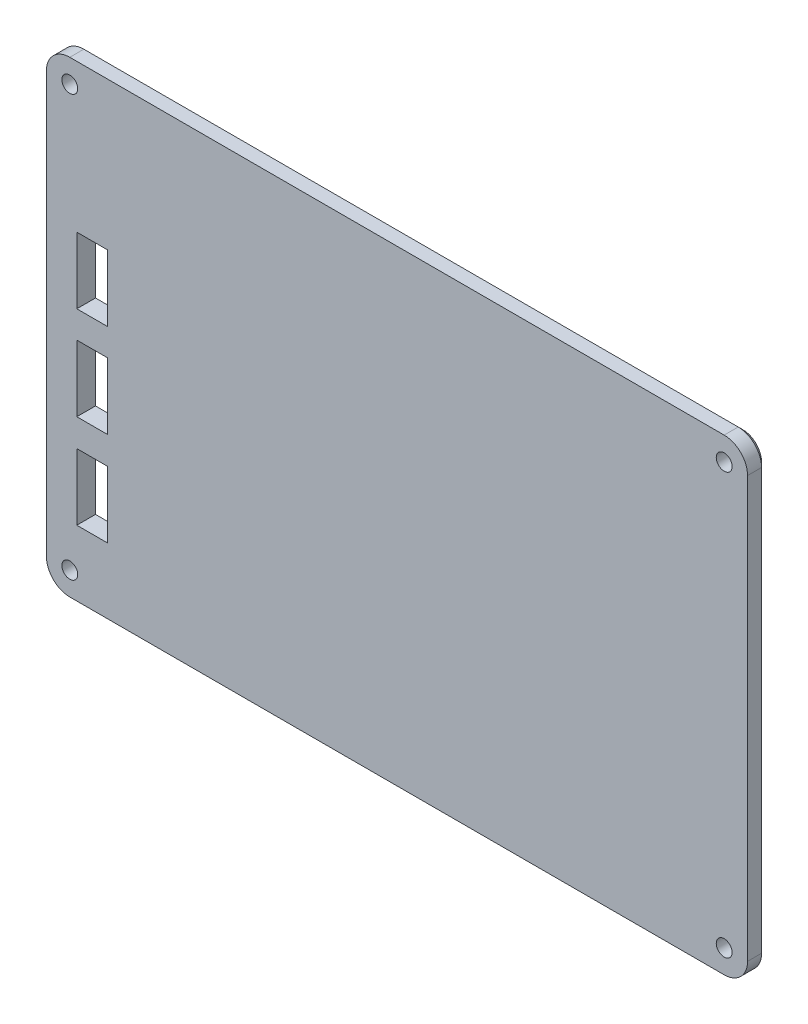
ISO-10303-21;
HEADER;
FILE_DESCRIPTION(('STEP AP214'),'2;1');
FILE_NAME('part.step','',(''),(''),'','','');
FILE_SCHEMA(('AUTOMOTIVE_DESIGN { 1 0 10303 214 1 1 1 1 }'));
ENDSEC;
DATA;
#1=APPLICATION_CONTEXT('core data for automotive mechanical design processes');
#2=APPLICATION_PROTOCOL_DEFINITION('international standard','automotive_design',2000,#1);
#3=PRODUCT_CONTEXT('',#1,'mechanical');
#4=PRODUCT('Part','Part','',(#3));
#5=PRODUCT_RELATED_PRODUCT_CATEGORY('part','',(#4));
#6=PRODUCT_DEFINITION_FORMATION('','',#4);
#7=PRODUCT_DEFINITION_CONTEXT('part definition',#1,'design');
#8=PRODUCT_DEFINITION('design','',#6,#7);
#9=PRODUCT_DEFINITION_SHAPE('','',#8);
#10=(LENGTH_UNIT() NAMED_UNIT(*) SI_UNIT(.MILLI.,.METRE.));
#11=(NAMED_UNIT(*) PLANE_ANGLE_UNIT() SI_UNIT($,.RADIAN.));
#12=(NAMED_UNIT(*) SI_UNIT($,.STERADIAN.) SOLID_ANGLE_UNIT());
#13=UNCERTAINTY_MEASURE_WITH_UNIT(LENGTH_MEASURE(1.E-05),#10,'distance_accuracy_value','');
#14=(GEOMETRIC_REPRESENTATION_CONTEXT(3) GLOBAL_UNCERTAINTY_ASSIGNED_CONTEXT((#13)) GLOBAL_UNIT_ASSIGNED_CONTEXT((#10,
#11,#12)) REPRESENTATION_CONTEXT('',''));
#15=CARTESIAN_POINT('',(0.,0.,0.));
#16=DIRECTION('',(0.,0.,1.));
#17=DIRECTION('',(1.,0.,0.));
#18=AXIS2_PLACEMENT_3D('',#15,#16,#17);
#19=CARTESIAN_POINT('',(70.,44.35,-90.));
#20=DIRECTION('',(0.,0.,1.));
#21=DIRECTION('',(1.,0.,0.));
#22=AXIS2_PLACEMENT_3D('',#19,#20,#21);
#23=CYLINDRICAL_SURFACE('',#22,5.);
#24=DIRECTION('',(0.,0.,1.));
#25=VECTOR('',#24,1.);
#26=CARTESIAN_POINT('',(75.,44.35,-90.));
#27=LINE('',#26,#25);
#28=CARTESIAN_POINT('',(75.,44.35,-89.));
#29=VERTEX_POINT('',#28);
#30=CARTESIAN_POINT('',(75.,44.35,-86.));
#31=VERTEX_POINT('',#30);
#32=EDGE_CURVE('E372',#29,#31,#27,.T.);
#33=ORIENTED_EDGE('',*,*,#32,.F.);
#34=CARTESIAN_POINT('',(70.,44.35,-89.));
#35=DIRECTION('',(0.,0.,-1.));
#36=DIRECTION('',(-1.,0.,0.));
#37=AXIS2_PLACEMENT_3D('',#34,#35,#36);
#38=CIRCLE('',#37,5.);
#39=CARTESIAN_POINT('',(70.,49.35,-89.));
#40=VERTEX_POINT('',#39);
#41=EDGE_CURVE('E44',#29,#40,#38,.F.);
#42=ORIENTED_EDGE('',*,*,#41,.T.);
#43=DIRECTION('',(0.,0.,1.));
#44=VECTOR('',#43,1.);
#45=CARTESIAN_POINT('',(70.,49.35,-90.));
#46=LINE('',#45,#44);
#47=CARTESIAN_POINT('',(70.,49.35,-86.));
#48=VERTEX_POINT('',#47);
#49=EDGE_CURVE('E358',#40,#48,#46,.T.);
#50=ORIENTED_EDGE('',*,*,#49,.T.);
#51=CARTESIAN_POINT('',(70.,44.35,-86.));
#52=DIRECTION('',(0.,0.,-1.));
#53=DIRECTION('',(-1.,0.,0.));
#54=AXIS2_PLACEMENT_3D('',#51,#52,#53);
#55=CIRCLE('',#54,5.);
#56=EDGE_CURVE('E334',#48,#31,#55,.T.);
#57=ORIENTED_EDGE('',*,*,#56,.T.);
#58=EDGE_LOOP('',(#33,#42,#50,#57));
#59=FACE_BOUND('',#58,.T.);
#60=ADVANCED_FACE('F35',(#59),#23,.T.);
#61=CARTESIAN_POINT('',(75.,44.35,-90.));
#62=DIRECTION('',(-1.,0.,0.));
#63=DIRECTION('',(0.,0.,1.));
#64=AXIS2_PLACEMENT_3D('',#61,#62,#63);
#65=PLANE('',#64);
#66=DIRECTION('',(0.,0.,1.));
#67=VECTOR('',#66,1.);
#68=CARTESIAN_POINT('',(75.,-45.65,-90.));
#69=LINE('',#68,#67);
#70=CARTESIAN_POINT('',(75.,-45.65,-89.));
#71=VERTEX_POINT('',#70);
#72=CARTESIAN_POINT('',(75.,-45.65,-86.));
#73=VERTEX_POINT('',#72);
#74=EDGE_CURVE('E370',#71,#73,#69,.T.);
#75=ORIENTED_EDGE('',*,*,#74,.F.);
#76=DIRECTION('',(0.,1.,0.));
#77=VECTOR('',#76,1.);
#78=CARTESIAN_POINT('',(75.,44.35,-89.));
#79=LINE('',#78,#77);
#80=EDGE_CURVE('E400',#71,#29,#79,.T.);
#81=ORIENTED_EDGE('',*,*,#80,.T.);
#82=ORIENTED_EDGE('',*,*,#32,.T.);
#83=DIRECTION('',(0.,-1.,0.));
#84=VECTOR('',#83,1.);
#85=CARTESIAN_POINT('',(75.,44.35,-86.));
#86=LINE('',#85,#84);
#87=EDGE_CURVE('E337',#31,#73,#86,.T.);
#88=ORIENTED_EDGE('',*,*,#87,.T.);
#89=EDGE_LOOP('',(#75,#81,#82,#88));
#90=FACE_BOUND('',#89,.T.);
#91=ADVANCED_FACE('F453',(#90),#65,.F.);
#92=CARTESIAN_POINT('',(70.,-45.65,-90.));
#93=DIRECTION('',(0.,0.,1.));
#94=DIRECTION('',(1.,0.,0.));
#95=AXIS2_PLACEMENT_3D('',#92,#93,#94);
#96=CYLINDRICAL_SURFACE('',#95,5.);
#97=DIRECTION('',(0.,0.,1.));
#98=VECTOR('',#97,1.);
#99=CARTESIAN_POINT('',(70.,-50.65,-90.));
#100=LINE('',#99,#98);
#101=CARTESIAN_POINT('',(70.,-50.65,-89.));
#102=VERTEX_POINT('',#101);
#103=CARTESIAN_POINT('',(70.,-50.65,-86.));
#104=VERTEX_POINT('',#103);
#105=EDGE_CURVE('E368',#102,#104,#100,.T.);
#106=ORIENTED_EDGE('',*,*,#105,.F.);
#107=CARTESIAN_POINT('',(70.,-45.65,-89.));
#108=DIRECTION('',(0.,0.,-1.));
#109=DIRECTION('',(-1.,0.,0.));
#110=AXIS2_PLACEMENT_3D('',#107,#108,#109);
#111=CIRCLE('',#110,5.);
#112=EDGE_CURVE('E396',#102,#71,#111,.F.);
#113=ORIENTED_EDGE('',*,*,#112,.T.);
#114=ORIENTED_EDGE('',*,*,#74,.T.);
#115=CARTESIAN_POINT('',(70.,-45.65,-86.));
#116=DIRECTION('',(0.,0.,-1.));
#117=DIRECTION('',(-1.,0.,0.));
#118=AXIS2_PLACEMENT_3D('',#115,#116,#117);
#119=CIRCLE('',#118,5.);
#120=EDGE_CURVE('E340',#73,#104,#119,.T.);
#121=ORIENTED_EDGE('',*,*,#120,.T.);
#122=EDGE_LOOP('',(#106,#113,#114,#121));
#123=FACE_BOUND('',#122,.T.);
#124=ADVANCED_FACE('F489',(#123),#96,.T.);
#125=CARTESIAN_POINT('',(70.,-50.65,-90.));
#126=DIRECTION('',(0.,1.,0.));
#127=DIRECTION('',(-1.,0.,0.));
#128=AXIS2_PLACEMENT_3D('',#125,#126,#127);
#129=PLANE('',#128);
#130=DIRECTION('',(0.,0.,1.));
#131=VECTOR('',#130,1.);
#132=CARTESIAN_POINT('',(-70.,-50.65,-90.));
#133=LINE('',#132,#131);
#134=CARTESIAN_POINT('',(-70.,-50.65,-89.));
#135=VERTEX_POINT('',#134);
#136=CARTESIAN_POINT('',(-70.,-50.65,-86.));
#137=VERTEX_POINT('',#136);
#138=EDGE_CURVE('E366',#135,#137,#133,.T.);
#139=ORIENTED_EDGE('',*,*,#138,.F.);
#140=DIRECTION('',(1.,0.,0.));
#141=VECTOR('',#140,1.);
#142=CARTESIAN_POINT('',(70.,-50.65,-89.));
#143=LINE('',#142,#141);
#144=EDGE_CURVE('E391',#135,#102,#143,.T.);
#145=ORIENTED_EDGE('',*,*,#144,.T.);
#146=ORIENTED_EDGE('',*,*,#105,.T.);
#147=DIRECTION('',(-1.,0.,0.));
#148=VECTOR('',#147,1.);
#149=CARTESIAN_POINT('',(70.,-50.65,-86.));
#150=LINE('',#149,#148);
#151=EDGE_CURVE('E343',#104,#137,#150,.T.);
#152=ORIENTED_EDGE('',*,*,#151,.T.);
#153=EDGE_LOOP('',(#139,#145,#146,#152));
#154=FACE_BOUND('',#153,.T.);
#155=ADVANCED_FACE('F485',(#154),#129,.F.);
#156=CARTESIAN_POINT('',(-70.,-45.65,-90.));
#157=DIRECTION('',(0.,0.,1.));
#158=DIRECTION('',(1.,0.,0.));
#159=AXIS2_PLACEMENT_3D('',#156,#157,#158);
#160=CYLINDRICAL_SURFACE('',#159,5.);
#161=DIRECTION('',(0.,0.,1.));
#162=VECTOR('',#161,1.);
#163=CARTESIAN_POINT('',(-75.,-45.65,-90.));
#164=LINE('',#163,#162);
#165=CARTESIAN_POINT('',(-75.,-45.65,-89.));
#166=VERTEX_POINT('',#165);
#167=CARTESIAN_POINT('',(-75.,-45.65,-86.));
#168=VERTEX_POINT('',#167);
#169=EDGE_CURVE('E364',#166,#168,#164,.T.);
#170=ORIENTED_EDGE('',*,*,#169,.F.);
#171=CARTESIAN_POINT('',(-70.,-45.65,-89.));
#172=DIRECTION('',(0.,0.,-1.));
#173=DIRECTION('',(-1.,0.,0.));
#174=AXIS2_PLACEMENT_3D('',#171,#172,#173);
#175=CIRCLE('',#174,5.);
#176=EDGE_CURVE('E394',#166,#135,#175,.F.);
#177=ORIENTED_EDGE('',*,*,#176,.T.);
#178=ORIENTED_EDGE('',*,*,#138,.T.);
#179=CARTESIAN_POINT('',(-70.,-45.65,-86.));
#180=DIRECTION('',(0.,0.,-1.));
#181=DIRECTION('',(-1.,0.,0.));
#182=AXIS2_PLACEMENT_3D('',#179,#180,#181);
#183=CIRCLE('',#182,5.);
#184=EDGE_CURVE('E346',#137,#168,#183,.T.);
#185=ORIENTED_EDGE('',*,*,#184,.T.);
#186=EDGE_LOOP('',(#170,#177,#178,#185));
#187=FACE_BOUND('',#186,.T.);
#188=ADVANCED_FACE('F480',(#187),#160,.T.);
#189=CARTESIAN_POINT('',(-75.,-45.65,-90.));
#190=DIRECTION('',(1.,0.,0.));
#191=DIRECTION('',(0.,0.,-1.));
#192=AXIS2_PLACEMENT_3D('',#189,#190,#191);
#193=PLANE('',#192);
#194=DIRECTION('',(0.,0.,1.));
#195=VECTOR('',#194,1.);
#196=CARTESIAN_POINT('',(-75.,44.35,-90.));
#197=LINE('',#196,#195);
#198=CARTESIAN_POINT('',(-75.,44.35,-89.));
#199=VERTEX_POINT('',#198);
#200=CARTESIAN_POINT('',(-75.,44.35,-86.));
#201=VERTEX_POINT('',#200);
#202=EDGE_CURVE('E362',#199,#201,#197,.T.);
#203=ORIENTED_EDGE('',*,*,#202,.F.);
#204=DIRECTION('',(0.,-1.,0.));
#205=VECTOR('',#204,1.);
#206=CARTESIAN_POINT('',(-75.,-45.65,-89.));
#207=LINE('',#206,#205);
#208=EDGE_CURVE('E398',#199,#166,#207,.T.);
#209=ORIENTED_EDGE('',*,*,#208,.T.);
#210=ORIENTED_EDGE('',*,*,#169,.T.);
#211=DIRECTION('',(0.,1.,0.));
#212=VECTOR('',#211,1.);
#213=CARTESIAN_POINT('',(-75.,-45.65,-86.));
#214=LINE('',#213,#212);
#215=EDGE_CURVE('E349',#168,#201,#214,.T.);
#216=ORIENTED_EDGE('',*,*,#215,.T.);
#217=EDGE_LOOP('',(#203,#209,#210,#216));
#218=FACE_BOUND('',#217,.T.);
#219=ADVANCED_FACE('F478',(#218),#193,.F.);
#220=CARTESIAN_POINT('',(-70.,44.35,-90.));
#221=DIRECTION('',(0.,0.,1.));
#222=DIRECTION('',(1.,0.,0.));
#223=AXIS2_PLACEMENT_3D('',#220,#221,#222);
#224=CYLINDRICAL_SURFACE('',#223,5.);
#225=DIRECTION('',(0.,0.,1.));
#226=VECTOR('',#225,1.);
#227=CARTESIAN_POINT('',(-70.,49.35,-90.));
#228=LINE('',#227,#226);
#229=CARTESIAN_POINT('',(-70.,49.35,-89.));
#230=VERTEX_POINT('',#229);
#231=CARTESIAN_POINT('',(-70.,49.35,-86.));
#232=VERTEX_POINT('',#231);
#233=EDGE_CURVE('E360',#230,#232,#228,.T.);
#234=ORIENTED_EDGE('',*,*,#233,.F.);
#235=CARTESIAN_POINT('',(-70.,44.35,-89.));
#236=DIRECTION('',(0.,0.,-1.));
#237=DIRECTION('',(-1.,0.,0.));
#238=AXIS2_PLACEMENT_3D('',#235,#236,#237);
#239=CIRCLE('',#238,5.);
#240=EDGE_CURVE('E402',#230,#199,#239,.F.);
#241=ORIENTED_EDGE('',*,*,#240,.T.);
#242=ORIENTED_EDGE('',*,*,#202,.T.);
#243=CARTESIAN_POINT('',(-70.,44.35,-86.));
#244=DIRECTION('',(0.,0.,-1.));
#245=DIRECTION('',(-1.,0.,0.));
#246=AXIS2_PLACEMENT_3D('',#243,#244,#245);
#247=CIRCLE('',#246,5.);
#248=EDGE_CURVE('E352',#201,#232,#247,.T.);
#249=ORIENTED_EDGE('',*,*,#248,.T.);
#250=EDGE_LOOP('',(#234,#241,#242,#249));
#251=FACE_BOUND('',#250,.T.);
#252=ADVANCED_FACE('F440',(#251),#224,.T.);
#253=CARTESIAN_POINT('',(-70.,49.35,-90.));
#254=DIRECTION('',(0.,-1.,0.));
#255=DIRECTION('',(1.,0.,0.));
#256=AXIS2_PLACEMENT_3D('',#253,#254,#255);
#257=PLANE('',#256);
#258=ORIENTED_EDGE('',*,*,#49,.F.);
#259=DIRECTION('',(-1.,0.,0.));
#260=VECTOR('',#259,1.);
#261=CARTESIAN_POINT('',(-70.,49.35,-89.));
#262=LINE('',#261,#260);
#263=EDGE_CURVE('E11',#40,#230,#262,.T.);
#264=ORIENTED_EDGE('',*,*,#263,.T.);
#265=ORIENTED_EDGE('',*,*,#233,.T.);
#266=DIRECTION('',(1.,0.,0.));
#267=VECTOR('',#266,1.);
#268=CARTESIAN_POINT('',(-70.,49.35,-86.));
#269=LINE('',#268,#267);
#270=EDGE_CURVE('E355',#232,#48,#269,.T.);
#271=ORIENTED_EDGE('',*,*,#270,.T.);
#272=EDGE_LOOP('',(#258,#264,#265,#271));
#273=FACE_BOUND('',#272,.T.);
#274=ADVANCED_FACE('F438',(#273),#257,.F.);
#275=CARTESIAN_POINT('',(70.,44.35,-90.));
#276=DIRECTION('',(0.,0.,-1.));
#277=DIRECTION('',(-1.,0.,0.));
#278=AXIS2_PLACEMENT_3D('',#275,#276,#277);
#279=PLANE('',#278);
#280=DIRECTION('',(0.,-1.,0.));
#281=VECTOR('',#280,1.);
#282=CARTESIAN_POINT('',(-61.9,17.7,-90.));
#283=LINE('',#282,#281);
#284=CARTESIAN_POINT('',(-61.9,17.7,-90.));
#285=VERTEX_POINT('',#284);
#286=CARTESIAN_POINT('',(-61.9,3.5,-90.));
#287=VERTEX_POINT('',#286);
#288=EDGE_CURVE('E52',#285,#287,#283,.T.);
#289=ORIENTED_EDGE('',*,*,#288,.F.);
#290=DIRECTION('',(1.,0.,0.));
#291=VECTOR('',#290,1.);
#292=CARTESIAN_POINT('',(-68.5,17.7,-90.));
#293=LINE('',#292,#291);
#294=CARTESIAN_POINT('',(-68.5,17.7,-90.));
#295=VERTEX_POINT('',#294);
#296=EDGE_CURVE('E215',#295,#285,#293,.T.);
#297=ORIENTED_EDGE('',*,*,#296,.F.);
#298=DIRECTION('',(0.,1.,0.));
#299=VECTOR('',#298,1.);
#300=CARTESIAN_POINT('',(-68.5,3.5,-90.));
#301=LINE('',#300,#299);
#302=CARTESIAN_POINT('',(-68.5,3.5,-90.));
#303=VERTEX_POINT('',#302);
#304=EDGE_CURVE('E218',#303,#295,#301,.T.);
#305=ORIENTED_EDGE('',*,*,#304,.F.);
#306=DIRECTION('',(-1.,0.,0.));
#307=VECTOR('',#306,1.);
#308=CARTESIAN_POINT('',(-61.9,3.5,-90.));
#309=LINE('',#308,#307);
#310=EDGE_CURVE('E224',#287,#303,#309,.T.);
#311=ORIENTED_EDGE('',*,*,#310,.F.);
#312=EDGE_LOOP('',(#289,#297,#305,#311));
#313=FACE_BOUND('',#312,.T.);
#314=DIRECTION('',(0.,-1.,0.));
#315=VECTOR('',#314,1.);
#316=CARTESIAN_POINT('',(-61.9,-2.3,-90.));
#317=LINE('',#316,#315);
#318=CARTESIAN_POINT('',(-61.9,-2.3,-90.));
#319=VERTEX_POINT('',#318);
#320=CARTESIAN_POINT('',(-61.9,-16.5,-90.));
#321=VERTEX_POINT('',#320);
#322=EDGE_CURVE('E230',#319,#321,#317,.T.);
#323=ORIENTED_EDGE('',*,*,#322,.F.);
#324=DIRECTION('',(1.,0.,0.));
#325=VECTOR('',#324,1.);
#326=CARTESIAN_POINT('',(-68.5,-2.3,-90.));
#327=LINE('',#326,#325);
#328=CARTESIAN_POINT('',(-68.5,-2.3,-90.));
#329=VERTEX_POINT('',#328);
#330=EDGE_CURVE('E238',#329,#319,#327,.T.);
#331=ORIENTED_EDGE('',*,*,#330,.F.);
#332=DIRECTION('',(0.,1.,0.));
#333=VECTOR('',#332,1.);
#334=CARTESIAN_POINT('',(-68.5,-16.5,-90.));
#335=LINE('',#334,#333);
#336=CARTESIAN_POINT('',(-68.5,-16.5,-90.));
#337=VERTEX_POINT('',#336);
#338=EDGE_CURVE('E252',#337,#329,#335,.T.);
#339=ORIENTED_EDGE('',*,*,#338,.F.);
#340=DIRECTION('',(-1.,0.,0.));
#341=VECTOR('',#340,1.);
#342=CARTESIAN_POINT('',(-61.9,-16.5,-90.));
#343=LINE('',#342,#341);
#344=EDGE_CURVE('E249',#321,#337,#343,.T.);
#345=ORIENTED_EDGE('',*,*,#344,.F.);
#346=EDGE_LOOP('',(#323,#331,#339,#345));
#347=FACE_BOUND('',#346,.T.);
#348=DIRECTION('',(1.,0.,0.));
#349=VECTOR('',#348,1.);
#350=CARTESIAN_POINT('',(-68.5,-22.4,-90.));
#351=LINE('',#350,#349);
#352=CARTESIAN_POINT('',(-68.5,-22.4,-90.));
#353=VERTEX_POINT('',#352);
#354=CARTESIAN_POINT('',(-61.9,-22.4,-90.));
#355=VERTEX_POINT('',#354);
#356=EDGE_CURVE('E259',#353,#355,#351,.T.);
#357=ORIENTED_EDGE('',*,*,#356,.F.);
#358=DIRECTION('',(0.,1.,0.));
#359=VECTOR('',#358,1.);
#360=CARTESIAN_POINT('',(-68.5,-36.6,-90.));
#361=LINE('',#360,#359);
#362=CARTESIAN_POINT('',(-68.5,-36.6,-90.));
#363=VERTEX_POINT('',#362);
#364=EDGE_CURVE('E270',#363,#353,#361,.T.);
#365=ORIENTED_EDGE('',*,*,#364,.F.);
#366=DIRECTION('',(-1.,0.,0.));
#367=VECTOR('',#366,1.);
#368=CARTESIAN_POINT('',(-61.9,-36.6,-90.));
#369=LINE('',#368,#367);
#370=CARTESIAN_POINT('',(-61.9,-36.6,-90.));
#371=VERTEX_POINT('',#370);
#372=EDGE_CURVE('E284',#371,#363,#369,.T.);
#373=ORIENTED_EDGE('',*,*,#372,.F.);
#374=DIRECTION('',(0.,-1.,0.));
#375=VECTOR('',#374,1.);
#376=CARTESIAN_POINT('',(-61.9,-22.4,-90.));
#377=LINE('',#376,#375);
#378=EDGE_CURVE('E281',#355,#371,#377,.T.);
#379=ORIENTED_EDGE('',*,*,#378,.F.);
#380=EDGE_LOOP('',(#357,#365,#373,#379));
#381=FACE_BOUND('',#380,.T.);
#382=CARTESIAN_POINT('',(70.,-45.65,-90.));
#383=DIRECTION('',(0.,0.,-1.));
#384=DIRECTION('',(-1.,0.,0.));
#385=AXIS2_PLACEMENT_3D('',#382,#383,#384);
#386=CIRCLE('',#385,4.00000000000003);
#387=CARTESIAN_POINT('',(74.,-45.65,-90.));
#388=VERTEX_POINT('',#387);
#389=CARTESIAN_POINT('',(70.,-49.65,-90.));
#390=VERTEX_POINT('',#389);
#391=EDGE_CURVE('E384',#388,#390,#386,.T.);
#392=ORIENTED_EDGE('',*,*,#391,.T.);
#393=DIRECTION('',(-1.,0.,0.));
#394=VECTOR('',#393,1.);
#395=CARTESIAN_POINT('',(-70.,-49.65,-90.));
#396=LINE('',#395,#394);
#397=CARTESIAN_POINT('',(-70.,-49.65,-90.));
#398=VERTEX_POINT('',#397);
#399=EDGE_CURVE('E388',#390,#398,#396,.T.);
#400=ORIENTED_EDGE('',*,*,#399,.T.);
#401=CARTESIAN_POINT('',(-70.,-45.65,-90.));
#402=DIRECTION('',(0.,0.,-1.));
#403=DIRECTION('',(-1.,0.,0.));
#404=AXIS2_PLACEMENT_3D('',#401,#402,#403);
#405=CIRCLE('',#404,4.00000000000003);
#406=CARTESIAN_POINT('',(-74.,-45.65,-90.));
#407=VERTEX_POINT('',#406);
#408=EDGE_CURVE('E386',#398,#407,#405,.T.);
#409=ORIENTED_EDGE('',*,*,#408,.T.);
#410=DIRECTION('',(0.,1.,0.));
#411=VECTOR('',#410,1.);
#412=CARTESIAN_POINT('',(-74.,44.35,-90.));
#413=LINE('',#412,#411);
#414=CARTESIAN_POINT('',(-74.,44.35,-90.));
#415=VERTEX_POINT('',#414);
#416=EDGE_CURVE('E382',#407,#415,#413,.T.);
#417=ORIENTED_EDGE('',*,*,#416,.T.);
#418=CARTESIAN_POINT('',(-70.,44.35,-90.));
#419=DIRECTION('',(0.,0.,-1.));
#420=DIRECTION('',(-1.,0.,0.));
#421=AXIS2_PLACEMENT_3D('',#418,#419,#420);
#422=CIRCLE('',#421,4.00000000000003);
#423=CARTESIAN_POINT('',(-70.,48.35,-90.));
#424=VERTEX_POINT('',#423);
#425=EDGE_CURVE('E378',#415,#424,#422,.T.);
#426=ORIENTED_EDGE('',*,*,#425,.T.);
#427=DIRECTION('',(1.,0.,0.));
#428=VECTOR('',#427,1.);
#429=CARTESIAN_POINT('',(70.,48.35,-90.));
#430=LINE('',#429,#428);
#431=CARTESIAN_POINT('',(70.,48.35,-90.));
#432=VERTEX_POINT('',#431);
#433=EDGE_CURVE('E374',#424,#432,#430,.T.);
#434=ORIENTED_EDGE('',*,*,#433,.T.);
#435=CARTESIAN_POINT('',(70.,44.35,-90.));
#436=DIRECTION('',(0.,0.,-1.));
#437=DIRECTION('',(-1.,0.,0.));
#438=AXIS2_PLACEMENT_3D('',#435,#436,#437);
#439=CIRCLE('',#438,4.00000000000003);
#440=CARTESIAN_POINT('',(74.,44.35,-90.));
#441=VERTEX_POINT('',#440);
#442=EDGE_CURVE('E376',#432,#441,#439,.T.);
#443=ORIENTED_EDGE('',*,*,#442,.T.);
#444=DIRECTION('',(0.,-1.,0.));
#445=VECTOR('',#444,1.);
#446=CARTESIAN_POINT('',(74.,-45.65,-90.));
#447=LINE('',#446,#445);
#448=EDGE_CURVE('E380',#441,#388,#447,.T.);
#449=ORIENTED_EDGE('',*,*,#448,.T.);
#450=EDGE_LOOP('',(#392,#400,#409,#417,#426,#434,#443,#449));
#451=FACE_BOUND('',#450,.T.);
#452=CARTESIAN_POINT('',(-70.,-45.6578119509744,-90.));
#453=DIRECTION('',(0.,0.,-1.));
#454=DIRECTION('',(-1.,0.,0.));
#455=AXIS2_PLACEMENT_3D('',#452,#453,#454);
#456=CIRCLE('',#455,3.15);
#457=CARTESIAN_POINT('',(-73.15,-45.6578119509744,-90.));
#458=VERTEX_POINT('',#457);
#459=EDGE_CURVE('E298',#458,#458,#456,.T.);
#460=ORIENTED_EDGE('',*,*,#459,.F.);
#461=EDGE_LOOP('',(#460));
#462=FACE_BOUND('',#461,.T.);
#463=CARTESIAN_POINT('',(-70.,44.3578119509744,-90.));
#464=DIRECTION('',(0.,0.,-1.));
#465=DIRECTION('',(-1.,0.,0.));
#466=AXIS2_PLACEMENT_3D('',#463,#464,#465);
#467=CIRCLE('',#466,3.15);
#468=CARTESIAN_POINT('',(-73.15,44.3578119509744,-90.));
#469=VERTEX_POINT('',#468);
#470=EDGE_CURVE('E307',#469,#469,#467,.T.);
#471=ORIENTED_EDGE('',*,*,#470,.F.);
#472=EDGE_LOOP('',(#471));
#473=FACE_BOUND('',#472,.T.);
#474=CARTESIAN_POINT('',(70.,44.3578119509744,-90.));
#475=DIRECTION('',(0.,0.,-1.));
#476=DIRECTION('',(-1.,0.,0.));
#477=AXIS2_PLACEMENT_3D('',#474,#475,#476);
#478=CIRCLE('',#477,3.15);
#479=CARTESIAN_POINT('',(66.85,44.3578119509744,-90.));
#480=VERTEX_POINT('',#479);
#481=EDGE_CURVE('E316',#480,#480,#478,.T.);
#482=ORIENTED_EDGE('',*,*,#481,.F.);
#483=EDGE_LOOP('',(#482));
#484=FACE_BOUND('',#483,.T.);
#485=CARTESIAN_POINT('',(70.,-45.6578119509744,-90.));
#486=DIRECTION('',(0.,0.,-1.));
#487=DIRECTION('',(-1.,0.,0.));
#488=AXIS2_PLACEMENT_3D('',#485,#486,#487);
#489=CIRCLE('',#488,3.15);
#490=CARTESIAN_POINT('',(66.85,-45.6578119509744,-90.));
#491=VERTEX_POINT('',#490);
#492=EDGE_CURVE('E325',#491,#491,#489,.T.);
#493=ORIENTED_EDGE('',*,*,#492,.F.);
#494=EDGE_LOOP('',(#493));
#495=FACE_BOUND('',#494,.T.);
#496=ADVANCED_FACE('F466',(#313,#347,#381,#451,#462,#473,#484,#495),#279,.T.);
#497=CARTESIAN_POINT('',(70.,44.35,-86.));
#498=DIRECTION('',(0.,0.,-1.));
#499=DIRECTION('',(-1.,0.,0.));
#500=AXIS2_PLACEMENT_3D('',#497,#498,#499);
#501=PLANE('',#500);
#502=DIRECTION('',(1.,0.,0.));
#503=VECTOR('',#502,1.);
#504=CARTESIAN_POINT('',(-68.5,17.7,-86.));
#505=LINE('',#504,#503);
#506=CARTESIAN_POINT('',(-68.5,17.7,-86.));
#507=VERTEX_POINT('',#506);
#508=CARTESIAN_POINT('',(-61.9,17.7,-86.));
#509=VERTEX_POINT('',#508);
#510=EDGE_CURVE('E205',#507,#509,#505,.T.);
#511=ORIENTED_EDGE('',*,*,#510,.T.);
#512=DIRECTION('',(0.,-1.,0.));
#513=VECTOR('',#512,1.);
#514=CARTESIAN_POINT('',(-61.9,17.7,-86.));
#515=LINE('',#514,#513);
#516=CARTESIAN_POINT('',(-61.9,3.5,-86.));
#517=VERTEX_POINT('',#516);
#518=EDGE_CURVE('E199',#509,#517,#515,.T.);
#519=ORIENTED_EDGE('',*,*,#518,.T.);
#520=DIRECTION('',(-1.,0.,0.));
#521=VECTOR('',#520,1.);
#522=CARTESIAN_POINT('',(-61.9,3.5,-86.));
#523=LINE('',#522,#521);
#524=CARTESIAN_POINT('',(-68.5,3.5,-86.));
#525=VERTEX_POINT('',#524);
#526=EDGE_CURVE('E208',#517,#525,#523,.T.);
#527=ORIENTED_EDGE('',*,*,#526,.T.);
#528=DIRECTION('',(0.,1.,0.));
#529=VECTOR('',#528,1.);
#530=CARTESIAN_POINT('',(-68.5,3.5,-86.));
#531=LINE('',#530,#529);
#532=EDGE_CURVE('E60',#525,#507,#531,.T.);
#533=ORIENTED_EDGE('',*,*,#532,.T.);
#534=EDGE_LOOP('',(#511,#519,#527,#533));
#535=FACE_BOUND('',#534,.T.);
#536=DIRECTION('',(1.,0.,0.));
#537=VECTOR('',#536,1.);
#538=CARTESIAN_POINT('',(-68.5,-2.3,-86.));
#539=LINE('',#538,#537);
#540=CARTESIAN_POINT('',(-68.5,-2.3,-86.));
#541=VERTEX_POINT('',#540);
#542=CARTESIAN_POINT('',(-61.9,-2.3,-86.));
#543=VERTEX_POINT('',#542);
#544=EDGE_CURVE('E244',#541,#543,#539,.T.);
#545=ORIENTED_EDGE('',*,*,#544,.T.);
#546=DIRECTION('',(0.,-1.,0.));
#547=VECTOR('',#546,1.);
#548=CARTESIAN_POINT('',(-61.9,-2.3,-86.));
#549=LINE('',#548,#547);
#550=CARTESIAN_POINT('',(-61.9,-16.5,-86.));
#551=VERTEX_POINT('',#550);
#552=EDGE_CURVE('E234',#543,#551,#549,.T.);
#553=ORIENTED_EDGE('',*,*,#552,.T.);
#554=DIRECTION('',(-1.,0.,0.));
#555=VECTOR('',#554,1.);
#556=CARTESIAN_POINT('',(-61.9,-16.5,-86.));
#557=LINE('',#556,#555);
#558=CARTESIAN_POINT('',(-68.5,-16.5,-86.));
#559=VERTEX_POINT('',#558);
#560=EDGE_CURVE('E237',#551,#559,#557,.T.);
#561=ORIENTED_EDGE('',*,*,#560,.T.);
#562=DIRECTION('',(0.,1.,0.));
#563=VECTOR('',#562,1.);
#564=CARTESIAN_POINT('',(-68.5,-16.5,-86.));
#565=LINE('',#564,#563);
#566=EDGE_CURVE('E241',#559,#541,#565,.T.);
#567=ORIENTED_EDGE('',*,*,#566,.T.);
#568=EDGE_LOOP('',(#545,#553,#561,#567));
#569=FACE_BOUND('',#568,.T.);
#570=DIRECTION('',(0.,1.,0.));
#571=VECTOR('',#570,1.);
#572=CARTESIAN_POINT('',(-68.5,-36.6,-86.));
#573=LINE('',#572,#571);
#574=CARTESIAN_POINT('',(-68.5,-36.6,-86.));
#575=VERTEX_POINT('',#574);
#576=CARTESIAN_POINT('',(-68.5,-22.4,-86.));
#577=VERTEX_POINT('',#576);
#578=EDGE_CURVE('E276',#575,#577,#573,.T.);
#579=ORIENTED_EDGE('',*,*,#578,.T.);
#580=DIRECTION('',(1.,0.,0.));
#581=VECTOR('',#580,1.);
#582=CARTESIAN_POINT('',(-68.5,-22.4,-86.));
#583=LINE('',#582,#581);
#584=CARTESIAN_POINT('',(-61.9,-22.4,-86.));
#585=VERTEX_POINT('',#584);
#586=EDGE_CURVE('E266',#577,#585,#583,.T.);
#587=ORIENTED_EDGE('',*,*,#586,.T.);
#588=DIRECTION('',(0.,-1.,0.));
#589=VECTOR('',#588,1.);
#590=CARTESIAN_POINT('',(-61.9,-22.4,-86.));
#591=LINE('',#590,#589);
#592=CARTESIAN_POINT('',(-61.9,-36.6,-86.));
#593=VERTEX_POINT('',#592);
#594=EDGE_CURVE('E269',#585,#593,#591,.T.);
#595=ORIENTED_EDGE('',*,*,#594,.T.);
#596=DIRECTION('',(-1.,0.,0.));
#597=VECTOR('',#596,1.);
#598=CARTESIAN_POINT('',(-61.9,-36.6,-86.));
#599=LINE('',#598,#597);
#600=EDGE_CURVE('E273',#593,#575,#599,.T.);
#601=ORIENTED_EDGE('',*,*,#600,.T.);
#602=EDGE_LOOP('',(#579,#587,#595,#601));
#603=FACE_BOUND('',#602,.T.);
#604=CARTESIAN_POINT('',(-70.,-45.6578119509744,-86.));
#605=DIRECTION('',(0.,0.,-1.));
#606=DIRECTION('',(-1.,0.,0.));
#607=AXIS2_PLACEMENT_3D('',#604,#605,#606);
#608=CIRCLE('',#607,1.69999999999999);
#609=CARTESIAN_POINT('',(-71.7,-45.6578119509744,-86.));
#610=VERTEX_POINT('',#609);
#611=EDGE_CURVE('E304',#610,#610,#608,.T.);
#612=ORIENTED_EDGE('',*,*,#611,.T.);
#613=EDGE_LOOP('',(#612));
#614=FACE_BOUND('',#613,.T.);
#615=CARTESIAN_POINT('',(-70.,44.3578119509744,-86.));
#616=DIRECTION('',(0.,0.,-1.));
#617=DIRECTION('',(-1.,0.,0.));
#618=AXIS2_PLACEMENT_3D('',#615,#616,#617);
#619=CIRCLE('',#618,1.69999999999999);
#620=CARTESIAN_POINT('',(-71.7,44.3578119509744,-86.));
#621=VERTEX_POINT('',#620);
#622=EDGE_CURVE('E313',#621,#621,#619,.T.);
#623=ORIENTED_EDGE('',*,*,#622,.T.);
#624=EDGE_LOOP('',(#623));
#625=FACE_BOUND('',#624,.T.);
#626=CARTESIAN_POINT('',(70.,44.3578119509744,-86.));
#627=DIRECTION('',(0.,0.,-1.));
#628=DIRECTION('',(-1.,0.,0.));
#629=AXIS2_PLACEMENT_3D('',#626,#627,#628);
#630=CIRCLE('',#629,1.69999999999999);
#631=CARTESIAN_POINT('',(68.3,44.3578119509744,-86.));
#632=VERTEX_POINT('',#631);
#633=EDGE_CURVE('E322',#632,#632,#630,.T.);
#634=ORIENTED_EDGE('',*,*,#633,.T.);
#635=EDGE_LOOP('',(#634));
#636=FACE_BOUND('',#635,.T.);
#637=CARTESIAN_POINT('',(70.,-45.6578119509744,-86.));
#638=DIRECTION('',(0.,0.,-1.));
#639=DIRECTION('',(-1.,0.,0.));
#640=AXIS2_PLACEMENT_3D('',#637,#638,#639);
#641=CIRCLE('',#640,1.69999999999999);
#642=CARTESIAN_POINT('',(68.3,-45.6578119509744,-86.));
#643=VERTEX_POINT('',#642);
#644=EDGE_CURVE('E331',#643,#643,#641,.T.);
#645=ORIENTED_EDGE('',*,*,#644,.T.);
#646=EDGE_LOOP('',(#645));
#647=FACE_BOUND('',#646,.T.);
#648=ORIENTED_EDGE('',*,*,#56,.F.);
#649=ORIENTED_EDGE('',*,*,#270,.F.);
#650=ORIENTED_EDGE('',*,*,#248,.F.);
#651=ORIENTED_EDGE('',*,*,#215,.F.);
#652=ORIENTED_EDGE('',*,*,#184,.F.);
#653=ORIENTED_EDGE('',*,*,#151,.F.);
#654=ORIENTED_EDGE('',*,*,#120,.F.);
#655=ORIENTED_EDGE('',*,*,#87,.F.);
#656=EDGE_LOOP('',(#648,#649,#650,#651,#652,#653,#654,#655));
#657=FACE_BOUND('',#656,.T.);
#658=ADVANCED_FACE('F212',(#535,#569,#603,#614,#625,#636,#647,#657),#501,.F.);
#659=CARTESIAN_POINT('',(70.,-45.6578119509744,-90.));
#660=DIRECTION('',(0.,0.,-1.));
#661=DIRECTION('',(-1.,0.,0.));
#662=AXIS2_PLACEMENT_3D('',#659,#660,#661);
#663=CYLINDRICAL_SURFACE('',#662,1.69999999999999);
#664=ORIENTED_EDGE('',*,*,#644,.F.);
#665=EDGE_LOOP('',(#664));
#666=FACE_BOUND('',#665,.T.);
#667=CARTESIAN_POINT('',(70.,-45.6578119509744,-88.55));
#668=DIRECTION('',(0.,0.,-1.));
#669=DIRECTION('',(-1.,0.,0.));
#670=AXIS2_PLACEMENT_3D('',#667,#668,#669);
#671=CIRCLE('',#670,1.69999999999999);
#672=CARTESIAN_POINT('',(68.3,-45.6578119509744,-88.55));
#673=VERTEX_POINT('',#672);
#674=EDGE_CURVE('E328',#673,#673,#671,.T.);
#675=ORIENTED_EDGE('',*,*,#674,.T.);
#676=EDGE_LOOP('',(#675));
#677=FACE_BOUND('',#676,.T.);
#678=ADVANCED_FACE('F559',(#666,#677),#663,.F.);
#679=CARTESIAN_POINT('',(70.,-45.6578119509744,-90.));
#680=DIRECTION('',(0.,0.,-1.));
#681=DIRECTION('',(-1.,0.,0.));
#682=AXIS2_PLACEMENT_3D('',#679,#680,#681);
#683=CONICAL_SURFACE('',#682,3.15,0.785398163397448);
#684=ORIENTED_EDGE('',*,*,#674,.F.);
#685=EDGE_LOOP('',(#684));
#686=FACE_BOUND('',#685,.T.);
#687=ORIENTED_EDGE('',*,*,#492,.T.);
#688=EDGE_LOOP('',(#687));
#689=FACE_BOUND('',#688,.T.);
#690=ADVANCED_FACE('F555',(#686,#689),#683,.F.);
#691=CARTESIAN_POINT('',(70.,44.3578119509744,-90.));
#692=DIRECTION('',(0.,0.,-1.));
#693=DIRECTION('',(-1.,0.,0.));
#694=AXIS2_PLACEMENT_3D('',#691,#692,#693);
#695=CYLINDRICAL_SURFACE('',#694,1.69999999999999);
#696=ORIENTED_EDGE('',*,*,#633,.F.);
#697=EDGE_LOOP('',(#696));
#698=FACE_BOUND('',#697,.T.);
#699=CARTESIAN_POINT('',(70.,44.3578119509744,-88.55));
#700=DIRECTION('',(0.,0.,-1.));
#701=DIRECTION('',(-1.,0.,0.));
#702=AXIS2_PLACEMENT_3D('',#699,#700,#701);
#703=CIRCLE('',#702,1.69999999999999);
#704=CARTESIAN_POINT('',(68.3,44.3578119509744,-88.55));
#705=VERTEX_POINT('',#704);
#706=EDGE_CURVE('E319',#705,#705,#703,.T.);
#707=ORIENTED_EDGE('',*,*,#706,.T.);
#708=EDGE_LOOP('',(#707));
#709=FACE_BOUND('',#708,.T.);
#710=ADVANCED_FACE('F551',(#698,#709),#695,.F.);
#711=CARTESIAN_POINT('',(70.,44.3578119509744,-90.));
#712=DIRECTION('',(0.,0.,-1.));
#713=DIRECTION('',(-1.,0.,0.));
#714=AXIS2_PLACEMENT_3D('',#711,#712,#713);
#715=CONICAL_SURFACE('',#714,3.15,0.785398163397448);
#716=ORIENTED_EDGE('',*,*,#706,.F.);
#717=EDGE_LOOP('',(#716));
#718=FACE_BOUND('',#717,.T.);
#719=ORIENTED_EDGE('',*,*,#481,.T.);
#720=EDGE_LOOP('',(#719));
#721=FACE_BOUND('',#720,.T.);
#722=ADVANCED_FACE('F547',(#718,#721),#715,.F.);
#723=CARTESIAN_POINT('',(-70.,44.3578119509744,-90.));
#724=DIRECTION('',(0.,0.,-1.));
#725=DIRECTION('',(-1.,0.,0.));
#726=AXIS2_PLACEMENT_3D('',#723,#724,#725);
#727=CYLINDRICAL_SURFACE('',#726,1.69999999999999);
#728=ORIENTED_EDGE('',*,*,#622,.F.);
#729=EDGE_LOOP('',(#728));
#730=FACE_BOUND('',#729,.T.);
#731=CARTESIAN_POINT('',(-70.,44.3578119509744,-88.55));
#732=DIRECTION('',(0.,0.,-1.));
#733=DIRECTION('',(-1.,0.,0.));
#734=AXIS2_PLACEMENT_3D('',#731,#732,#733);
#735=CIRCLE('',#734,1.69999999999999);
#736=CARTESIAN_POINT('',(-71.7,44.3578119509744,-88.55));
#737=VERTEX_POINT('',#736);
#738=EDGE_CURVE('E310',#737,#737,#735,.T.);
#739=ORIENTED_EDGE('',*,*,#738,.T.);
#740=EDGE_LOOP('',(#739));
#741=FACE_BOUND('',#740,.T.);
#742=ADVANCED_FACE('F543',(#730,#741),#727,.F.);
#743=CARTESIAN_POINT('',(-70.,44.3578119509744,-90.));
#744=DIRECTION('',(0.,0.,-1.));
#745=DIRECTION('',(-1.,0.,0.));
#746=AXIS2_PLACEMENT_3D('',#743,#744,#745);
#747=CONICAL_SURFACE('',#746,3.15,0.785398163397448);
#748=ORIENTED_EDGE('',*,*,#738,.F.);
#749=EDGE_LOOP('',(#748));
#750=FACE_BOUND('',#749,.T.);
#751=ORIENTED_EDGE('',*,*,#470,.T.);
#752=EDGE_LOOP('',(#751));
#753=FACE_BOUND('',#752,.T.);
#754=ADVANCED_FACE('F533',(#750,#753),#747,.F.);
#755=CARTESIAN_POINT('',(-70.,-45.6578119509744,-90.));
#756=DIRECTION('',(0.,0.,-1.));
#757=DIRECTION('',(-1.,0.,0.));
#758=AXIS2_PLACEMENT_3D('',#755,#756,#757);
#759=CYLINDRICAL_SURFACE('',#758,1.69999999999999);
#760=ORIENTED_EDGE('',*,*,#611,.F.);
#761=EDGE_LOOP('',(#760));
#762=FACE_BOUND('',#761,.T.);
#763=CARTESIAN_POINT('',(-70.,-45.6578119509744,-88.55));
#764=DIRECTION('',(0.,0.,-1.));
#765=DIRECTION('',(-1.,0.,0.));
#766=AXIS2_PLACEMENT_3D('',#763,#764,#765);
#767=CIRCLE('',#766,1.69999999999999);
#768=CARTESIAN_POINT('',(-71.7,-45.6578119509744,-88.55));
#769=VERTEX_POINT('',#768);
#770=EDGE_CURVE('E301',#769,#769,#767,.T.);
#771=ORIENTED_EDGE('',*,*,#770,.T.);
#772=EDGE_LOOP('',(#771));
#773=FACE_BOUND('',#772,.T.);
#774=ADVANCED_FACE('F527',(#762,#773),#759,.F.);
#775=CARTESIAN_POINT('',(-70.,-45.6578119509744,-90.));
#776=DIRECTION('',(0.,0.,-1.));
#777=DIRECTION('',(-1.,0.,0.));
#778=AXIS2_PLACEMENT_3D('',#775,#776,#777);
#779=CONICAL_SURFACE('',#778,3.15,0.785398163397448);
#780=ORIENTED_EDGE('',*,*,#770,.F.);
#781=EDGE_LOOP('',(#780));
#782=FACE_BOUND('',#781,.T.);
#783=ORIENTED_EDGE('',*,*,#459,.T.);
#784=EDGE_LOOP('',(#783));
#785=FACE_BOUND('',#784,.T.);
#786=ADVANCED_FACE('F523',(#782,#785),#779,.F.);
#787=CARTESIAN_POINT('',(70.,48.35,-90.));
#788=DIRECTION('',(0.,0.707106781186557,-0.707106781186538));
#789=DIRECTION('',(-1.,0.,0.));
#790=AXIS2_PLACEMENT_3D('',#787,#788,#789);
#791=PLANE('',#790);
#792=DIRECTION('',(0.,-0.707106781186538,-0.707106781186557));
#793=VECTOR('',#792,1.);
#794=CARTESIAN_POINT('',(-70.,49.35,-89.));
#795=LINE('',#794,#793);
#796=EDGE_CURVE('E419',#230,#424,#795,.T.);
#797=ORIENTED_EDGE('',*,*,#796,.F.);
#798=ORIENTED_EDGE('',*,*,#263,.F.);
#799=DIRECTION('',(0.,0.707106781186538,0.707106781186557));
#800=VECTOR('',#799,1.);
#801=CARTESIAN_POINT('',(70.,48.35,-90.));
#802=LINE('',#801,#800);
#803=EDGE_CURVE('E39',#432,#40,#802,.T.);
#804=ORIENTED_EDGE('',*,*,#803,.F.);
#805=ORIENTED_EDGE('',*,*,#433,.F.);
#806=EDGE_LOOP('',(#797,#798,#804,#805));
#807=FACE_BOUND('',#806,.T.);
#808=ADVANCED_FACE('F37',(#807),#791,.T.);
#809=CARTESIAN_POINT('',(70.,44.35,-90.));
#810=DIRECTION('',(0.,0.,1.));
#811=DIRECTION('',(1.,0.,0.));
#812=AXIS2_PLACEMENT_3D('',#809,#810,#811);
#813=CONICAL_SURFACE('',#812,4.00000000000003,0.785398163397435);
#814=ORIENTED_EDGE('',*,*,#803,.T.);
#815=ORIENTED_EDGE('',*,*,#41,.F.);
#816=DIRECTION('',(0.707106781186538,0.,0.707106781186557));
#817=VECTOR('',#816,1.);
#818=CARTESIAN_POINT('',(74.,44.35,-90.));
#819=LINE('',#818,#817);
#820=EDGE_CURVE('E417',#441,#29,#819,.T.);
#821=ORIENTED_EDGE('',*,*,#820,.F.);
#822=ORIENTED_EDGE('',*,*,#442,.F.);
#823=EDGE_LOOP('',(#814,#815,#821,#822));
#824=FACE_BOUND('',#823,.T.);
#825=ADVANCED_FACE('F430',(#824),#813,.T.);
#826=CARTESIAN_POINT('',(-70.,44.35,-90.));
#827=DIRECTION('',(0.,0.,1.));
#828=DIRECTION('',(1.,0.,0.));
#829=AXIS2_PLACEMENT_3D('',#826,#827,#828);
#830=CONICAL_SURFACE('',#829,4.00000000000003,0.785398163397435);
#831=ORIENTED_EDGE('',*,*,#796,.T.);
#832=ORIENTED_EDGE('',*,*,#425,.F.);
#833=DIRECTION('',(0.707106781186538,0.,-0.707106781186557));
#834=VECTOR('',#833,1.);
#835=CARTESIAN_POINT('',(-75.,44.35,-89.));
#836=LINE('',#835,#834);
#837=EDGE_CURVE('E414',#199,#415,#836,.T.);
#838=ORIENTED_EDGE('',*,*,#837,.F.);
#839=ORIENTED_EDGE('',*,*,#240,.F.);
#840=EDGE_LOOP('',(#831,#832,#838,#839));
#841=FACE_BOUND('',#840,.T.);
#842=ADVANCED_FACE('F470',(#841),#830,.T.);
#843=CARTESIAN_POINT('',(74.,44.35,-90.));
#844=DIRECTION('',(0.707106781186557,0.,-0.707106781186538));
#845=DIRECTION('',(0.,1.,0.));
#846=AXIS2_PLACEMENT_3D('',#843,#844,#845);
#847=PLANE('',#846);
#848=ORIENTED_EDGE('',*,*,#820,.T.);
#849=ORIENTED_EDGE('',*,*,#80,.F.);
#850=DIRECTION('',(0.707106781186538,0.,0.707106781186557));
#851=VECTOR('',#850,1.);
#852=CARTESIAN_POINT('',(74.,-45.65,-90.));
#853=LINE('',#852,#851);
#854=EDGE_CURVE('E411',#388,#71,#853,.T.);
#855=ORIENTED_EDGE('',*,*,#854,.F.);
#856=ORIENTED_EDGE('',*,*,#448,.F.);
#857=EDGE_LOOP('',(#848,#849,#855,#856));
#858=FACE_BOUND('',#857,.T.);
#859=ADVANCED_FACE('F457',(#858),#847,.T.);
#860=CARTESIAN_POINT('',(-74.,44.35,-90.));
#861=DIRECTION('',(-0.707106781186557,0.,-0.707106781186538));
#862=DIRECTION('',(0.,-1.,0.));
#863=AXIS2_PLACEMENT_3D('',#860,#861,#862);
#864=PLANE('',#863);
#865=ORIENTED_EDGE('',*,*,#837,.T.);
#866=ORIENTED_EDGE('',*,*,#416,.F.);
#867=DIRECTION('',(0.707106781186538,0.,-0.707106781186557));
#868=VECTOR('',#867,1.);
#869=CARTESIAN_POINT('',(-75.,-45.65,-89.));
#870=LINE('',#869,#868);
#871=EDGE_CURVE('E408',#166,#407,#870,.T.);
#872=ORIENTED_EDGE('',*,*,#871,.F.);
#873=ORIENTED_EDGE('',*,*,#208,.F.);
#874=EDGE_LOOP('',(#865,#866,#872,#873));
#875=FACE_BOUND('',#874,.T.);
#876=ADVANCED_FACE('F473',(#875),#864,.T.);
#877=CARTESIAN_POINT('',(70.,-45.65,-90.));
#878=DIRECTION('',(0.,0.,1.));
#879=DIRECTION('',(1.,0.,0.));
#880=AXIS2_PLACEMENT_3D('',#877,#878,#879);
#881=CONICAL_SURFACE('',#880,4.00000000000003,0.785398163397435);
#882=ORIENTED_EDGE('',*,*,#854,.T.);
#883=ORIENTED_EDGE('',*,*,#112,.F.);
#884=DIRECTION('',(0.,-0.707106781186538,0.707106781186557));
#885=VECTOR('',#884,1.);
#886=CARTESIAN_POINT('',(70.,-49.65,-90.));
#887=LINE('',#886,#885);
#888=EDGE_CURVE('E406',#390,#102,#887,.T.);
#889=ORIENTED_EDGE('',*,*,#888,.F.);
#890=ORIENTED_EDGE('',*,*,#391,.F.);
#891=EDGE_LOOP('',(#882,#883,#889,#890));
#892=FACE_BOUND('',#891,.T.);
#893=ADVANCED_FACE('F462',(#892),#881,.T.);
#894=CARTESIAN_POINT('',(-70.,-45.65,-90.));
#895=DIRECTION('',(0.,0.,1.));
#896=DIRECTION('',(1.,0.,0.));
#897=AXIS2_PLACEMENT_3D('',#894,#895,#896);
#898=CONICAL_SURFACE('',#897,4.00000000000003,0.785398163397433);
#899=ORIENTED_EDGE('',*,*,#871,.T.);
#900=ORIENTED_EDGE('',*,*,#408,.F.);
#901=DIRECTION('',(0.,0.707106781186535,-0.70710678118656));
#902=VECTOR('',#901,1.);
#903=CARTESIAN_POINT('',(-70.,-50.65,-89.));
#904=LINE('',#903,#902);
#905=EDGE_CURVE('E291',#135,#398,#904,.T.);
#906=ORIENTED_EDGE('',*,*,#905,.F.);
#907=ORIENTED_EDGE('',*,*,#176,.F.);
#908=EDGE_LOOP('',(#899,#900,#906,#907));
#909=FACE_BOUND('',#908,.T.);
#910=ADVANCED_FACE('F507',(#909),#898,.T.);
#911=CARTESIAN_POINT('',(70.,-49.65,-90.));
#912=DIRECTION('',(0.,-0.707106781186555,-0.70710678118654));
#913=DIRECTION('',(1.,0.,0.));
#914=AXIS2_PLACEMENT_3D('',#911,#912,#913);
#915=PLANE('',#914);
#916=ORIENTED_EDGE('',*,*,#888,.T.);
#917=ORIENTED_EDGE('',*,*,#144,.F.);
#918=ORIENTED_EDGE('',*,*,#905,.T.);
#919=ORIENTED_EDGE('',*,*,#399,.F.);
#920=EDGE_LOOP('',(#916,#917,#918,#919));
#921=FACE_BOUND('',#920,.T.);
#922=ADVANCED_FACE('F503',(#921),#915,.T.);
#923=CARTESIAN_POINT('',(-68.5,-22.4,-86.));
#924=DIRECTION('',(0.,1.,0.));
#925=DIRECTION('',(0.,0.,1.));
#926=AXIS2_PLACEMENT_3D('',#923,#924,#925);
#927=PLANE('',#926);
#928=ORIENTED_EDGE('',*,*,#356,.T.);
#929=DIRECTION('',(0.,0.,-1.));
#930=VECTOR('',#929,1.);
#931=CARTESIAN_POINT('',(-61.9,-22.4,-86.));
#932=LINE('',#931,#930);
#933=EDGE_CURVE('E279',#585,#355,#932,.T.);
#934=ORIENTED_EDGE('',*,*,#933,.F.);
#935=ORIENTED_EDGE('',*,*,#586,.F.);
#936=DIRECTION('',(0.,0.,-1.));
#937=VECTOR('',#936,1.);
#938=CARTESIAN_POINT('',(-68.5,-22.4,-86.));
#939=LINE('',#938,#937);
#940=EDGE_CURVE('E289',#577,#353,#939,.T.);
#941=ORIENTED_EDGE('',*,*,#940,.T.);
#942=EDGE_LOOP('',(#928,#934,#935,#941));
#943=FACE_BOUND('',#942,.T.);
#944=ADVANCED_FACE('F506',(#943),#927,.F.);
#945=CARTESIAN_POINT('',(-68.5,-36.6,-86.));
#946=DIRECTION('',(-1.,0.,0.));
#947=DIRECTION('',(0.,0.,1.));
#948=AXIS2_PLACEMENT_3D('',#945,#946,#947);
#949=PLANE('',#948);
#950=ORIENTED_EDGE('',*,*,#364,.T.);
#951=ORIENTED_EDGE('',*,*,#940,.F.);
#952=ORIENTED_EDGE('',*,*,#578,.F.);
#953=DIRECTION('',(0.,0.,-1.));
#954=VECTOR('',#953,1.);
#955=CARTESIAN_POINT('',(-68.5,-36.6,-86.));
#956=LINE('',#955,#954);
#957=EDGE_CURVE('E292',#575,#363,#956,.T.);
#958=ORIENTED_EDGE('',*,*,#957,.T.);
#959=EDGE_LOOP('',(#950,#951,#952,#958));
#960=FACE_BOUND('',#959,.T.);
#961=ADVANCED_FACE('F722',(#960),#949,.F.);
#962=CARTESIAN_POINT('',(-61.9,-36.6,-86.));
#963=DIRECTION('',(0.,-1.,0.));
#964=DIRECTION('',(0.,0.,-1.));
#965=AXIS2_PLACEMENT_3D('',#962,#963,#964);
#966=PLANE('',#965);
#967=ORIENTED_EDGE('',*,*,#372,.T.);
#968=ORIENTED_EDGE('',*,*,#957,.F.);
#969=ORIENTED_EDGE('',*,*,#600,.F.);
#970=DIRECTION('',(0.,0.,-1.));
#971=VECTOR('',#970,1.);
#972=CARTESIAN_POINT('',(-61.9,-36.6,-86.));
#973=LINE('',#972,#971);
#974=EDGE_CURVE('E294',#593,#371,#973,.T.);
#975=ORIENTED_EDGE('',*,*,#974,.T.);
#976=EDGE_LOOP('',(#967,#968,#969,#975));
#977=FACE_BOUND('',#976,.T.);
#978=ADVANCED_FACE('F730',(#977),#966,.F.);
#979=CARTESIAN_POINT('',(-61.9,-22.4,-86.));
#980=DIRECTION('',(1.,0.,0.));
#981=DIRECTION('',(0.,0.,-1.));
#982=AXIS2_PLACEMENT_3D('',#979,#980,#981);
#983=PLANE('',#982);
#984=ORIENTED_EDGE('',*,*,#378,.T.);
#985=ORIENTED_EDGE('',*,*,#974,.F.);
#986=ORIENTED_EDGE('',*,*,#594,.F.);
#987=ORIENTED_EDGE('',*,*,#933,.T.);
#988=EDGE_LOOP('',(#984,#985,#986,#987));
#989=FACE_BOUND('',#988,.T.);
#990=ADVANCED_FACE('F739',(#989),#983,.F.);
#991=CARTESIAN_POINT('',(-61.9,-2.3,-86.));
#992=DIRECTION('',(1.,0.,0.));
#993=DIRECTION('',(0.,0.,-1.));
#994=AXIS2_PLACEMENT_3D('',#991,#992,#993);
#995=PLANE('',#994);
#996=ORIENTED_EDGE('',*,*,#322,.T.);
#997=DIRECTION('',(0.,0.,-1.));
#998=VECTOR('',#997,1.);
#999=CARTESIAN_POINT('',(-61.9,-16.5,-86.));
#1000=LINE('',#999,#998);
#1001=EDGE_CURVE('E247',#551,#321,#1000,.T.);
#1002=ORIENTED_EDGE('',*,*,#1001,.F.);
#1003=ORIENTED_EDGE('',*,*,#552,.F.);
#1004=DIRECTION('',(0.,0.,-1.));
#1005=VECTOR('',#1004,1.);
#1006=CARTESIAN_POINT('',(-61.9,-2.3,-86.));
#1007=LINE('',#1006,#1005);
#1008=EDGE_CURVE('E257',#543,#319,#1007,.T.);
#1009=ORIENTED_EDGE('',*,*,#1008,.T.);
#1010=EDGE_LOOP('',(#996,#1002,#1003,#1009));
#1011=FACE_BOUND('',#1010,.T.);
#1012=ADVANCED_FACE('F748',(#1011),#995,.F.);
#1013=CARTESIAN_POINT('',(-68.5,-2.3,-86.));
#1014=DIRECTION('',(0.,1.,0.));
#1015=DIRECTION('',(0.,0.,1.));
#1016=AXIS2_PLACEMENT_3D('',#1013,#1014,#1015);
#1017=PLANE('',#1016);
#1018=ORIENTED_EDGE('',*,*,#330,.T.);
#1019=ORIENTED_EDGE('',*,*,#1008,.F.);
#1020=ORIENTED_EDGE('',*,*,#544,.F.);
#1021=DIRECTION('',(0.,0.,-1.));
#1022=VECTOR('',#1021,1.);
#1023=CARTESIAN_POINT('',(-68.5,-2.3,-86.));
#1024=LINE('',#1023,#1022);
#1025=EDGE_CURVE('E260',#541,#329,#1024,.T.);
#1026=ORIENTED_EDGE('',*,*,#1025,.T.);
#1027=EDGE_LOOP('',(#1018,#1019,#1020,#1026));
#1028=FACE_BOUND('',#1027,.T.);
#1029=ADVANCED_FACE('F756',(#1028),#1017,.F.);
#1030=CARTESIAN_POINT('',(-68.5,-16.5,-86.));
#1031=DIRECTION('',(-1.,0.,0.));
#1032=DIRECTION('',(0.,0.,1.));
#1033=AXIS2_PLACEMENT_3D('',#1030,#1031,#1032);
#1034=PLANE('',#1033);
#1035=ORIENTED_EDGE('',*,*,#338,.T.);
#1036=ORIENTED_EDGE('',*,*,#1025,.F.);
#1037=ORIENTED_EDGE('',*,*,#566,.F.);
#1038=DIRECTION('',(0.,0.,-1.));
#1039=VECTOR('',#1038,1.);
#1040=CARTESIAN_POINT('',(-68.5,-16.5,-86.));
#1041=LINE('',#1040,#1039);
#1042=EDGE_CURVE('E262',#559,#337,#1041,.T.);
#1043=ORIENTED_EDGE('',*,*,#1042,.T.);
#1044=EDGE_LOOP('',(#1035,#1036,#1037,#1043));
#1045=FACE_BOUND('',#1044,.T.);
#1046=ADVANCED_FACE('F765',(#1045),#1034,.F.);
#1047=CARTESIAN_POINT('',(-61.9,-16.5,-86.));
#1048=DIRECTION('',(0.,-1.,0.));
#1049=DIRECTION('',(0.,0.,-1.));
#1050=AXIS2_PLACEMENT_3D('',#1047,#1048,#1049);
#1051=PLANE('',#1050);
#1052=ORIENTED_EDGE('',*,*,#344,.T.);
#1053=ORIENTED_EDGE('',*,*,#1042,.F.);
#1054=ORIENTED_EDGE('',*,*,#560,.F.);
#1055=ORIENTED_EDGE('',*,*,#1001,.T.);
#1056=EDGE_LOOP('',(#1052,#1053,#1054,#1055));
#1057=FACE_BOUND('',#1056,.T.);
#1058=ADVANCED_FACE('F774',(#1057),#1051,.F.);
#1059=CARTESIAN_POINT('',(-61.9,17.7,-86.));
#1060=DIRECTION('',(1.,0.,0.));
#1061=DIRECTION('',(0.,0.,-1.));
#1062=AXIS2_PLACEMENT_3D('',#1059,#1060,#1061);
#1063=PLANE('',#1062);
#1064=ORIENTED_EDGE('',*,*,#288,.T.);
#1065=DIRECTION('',(0.,0.,-1.));
#1066=VECTOR('',#1065,1.);
#1067=CARTESIAN_POINT('',(-61.9,3.5,-86.));
#1068=LINE('',#1067,#1066);
#1069=EDGE_CURVE('E195',#517,#287,#1068,.T.);
#1070=ORIENTED_EDGE('',*,*,#1069,.F.);
#1071=ORIENTED_EDGE('',*,*,#518,.F.);
#1072=DIRECTION('',(0.,0.,-1.));
#1073=VECTOR('',#1072,1.);
#1074=CARTESIAN_POINT('',(-61.9,17.7,-86.));
#1075=LINE('',#1074,#1073);
#1076=EDGE_CURVE('E228',#509,#285,#1075,.T.);
#1077=ORIENTED_EDGE('',*,*,#1076,.T.);
#1078=EDGE_LOOP('',(#1064,#1070,#1071,#1077));
#1079=FACE_BOUND('',#1078,.T.);
#1080=ADVANCED_FACE('F197',(#1079),#1063,.F.);
#1081=CARTESIAN_POINT('',(-68.5,17.7,-86.));
#1082=DIRECTION('',(0.,1.,0.));
#1083=DIRECTION('',(0.,0.,1.));
#1084=AXIS2_PLACEMENT_3D('',#1081,#1082,#1083);
#1085=PLANE('',#1084);
#1086=ORIENTED_EDGE('',*,*,#296,.T.);
#1087=ORIENTED_EDGE('',*,*,#1076,.F.);
#1088=ORIENTED_EDGE('',*,*,#510,.F.);
#1089=DIRECTION('',(0.,0.,-1.));
#1090=VECTOR('',#1089,1.);
#1091=CARTESIAN_POINT('',(-68.5,17.7,-86.));
#1092=LINE('',#1091,#1090);
#1093=EDGE_CURVE('E231',#507,#295,#1092,.T.);
#1094=ORIENTED_EDGE('',*,*,#1093,.T.);
#1095=EDGE_LOOP('',(#1086,#1087,#1088,#1094));
#1096=FACE_BOUND('',#1095,.T.);
#1097=ADVANCED_FACE('F791',(#1096),#1085,.F.);
#1098=CARTESIAN_POINT('',(-68.5,3.5,-86.));
#1099=DIRECTION('',(-1.,0.,0.));
#1100=DIRECTION('',(0.,0.,1.));
#1101=AXIS2_PLACEMENT_3D('',#1098,#1099,#1100);
#1102=PLANE('',#1101);
#1103=ORIENTED_EDGE('',*,*,#304,.T.);
#1104=ORIENTED_EDGE('',*,*,#1093,.F.);
#1105=ORIENTED_EDGE('',*,*,#532,.F.);
#1106=DIRECTION('',(0.,0.,-1.));
#1107=VECTOR('',#1106,1.);
#1108=CARTESIAN_POINT('',(-68.5,3.5,-86.));
#1109=LINE('',#1108,#1107);
#1110=EDGE_CURVE('E204',#525,#303,#1109,.T.);
#1111=ORIENTED_EDGE('',*,*,#1110,.T.);
#1112=EDGE_LOOP('',(#1103,#1104,#1105,#1111));
#1113=FACE_BOUND('',#1112,.T.);
#1114=ADVANCED_FACE('F799',(#1113),#1102,.F.);
#1115=CARTESIAN_POINT('',(-61.9,3.5,-86.));
#1116=DIRECTION('',(0.,-1.,0.));
#1117=DIRECTION('',(0.,0.,-1.));
#1118=AXIS2_PLACEMENT_3D('',#1115,#1116,#1117);
#1119=PLANE('',#1118);
#1120=ORIENTED_EDGE('',*,*,#310,.T.);
#1121=ORIENTED_EDGE('',*,*,#1110,.F.);
#1122=ORIENTED_EDGE('',*,*,#526,.F.);
#1123=ORIENTED_EDGE('',*,*,#1069,.T.);
#1124=EDGE_LOOP('',(#1120,#1121,#1122,#1123));
#1125=FACE_BOUND('',#1124,.T.);
#1126=ADVANCED_FACE('F209',(#1125),#1119,.F.);
#1127=CLOSED_SHELL('',(#60,#91,#124,#155,#188,#219,#252,#274,#496,#658,#678,#690,#710,#722,#742,
#754,#774,#786,#808,#825,#842,#859,#876,#893,#910,#922,#944,#961,#978,#990,#1012,#1029,#1046,
#1058,#1080,#1097,#1114,#1126));
#1128=MANIFOLD_SOLID_BREP('B2',#1127);
#1129=ADVANCED_BREP_SHAPE_REPRESENTATION('',(#18,#1128),#14);
#1130=SHAPE_DEFINITION_REPRESENTATION(#9,#1129);
ENDSEC;
END-ISO-10303-21;
